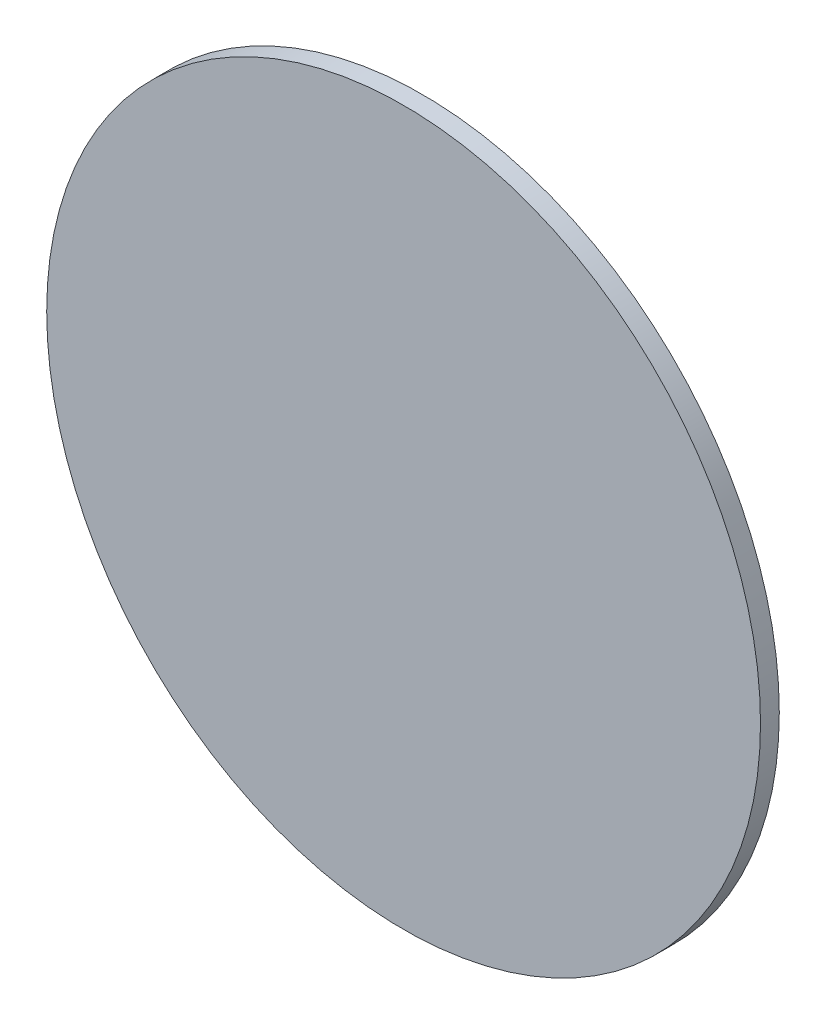
ISO-10303-21;
HEADER;
FILE_DESCRIPTION(('STEP AP214'),'2;1');
FILE_NAME('part.step','',(''),(''),'','','');
FILE_SCHEMA(('AUTOMOTIVE_DESIGN { 1 0 10303 214 1 1 1 1 }'));
ENDSEC;
DATA;
#1=APPLICATION_CONTEXT('core data for automotive mechanical design processes');
#2=APPLICATION_PROTOCOL_DEFINITION('international standard','automotive_design',2000,#1);
#3=PRODUCT_CONTEXT('',#1,'mechanical');
#4=PRODUCT('Part','Part','',(#3));
#5=PRODUCT_RELATED_PRODUCT_CATEGORY('part','',(#4));
#6=PRODUCT_DEFINITION_FORMATION('','',#4);
#7=PRODUCT_DEFINITION_CONTEXT('part definition',#1,'design');
#8=PRODUCT_DEFINITION('design','',#6,#7);
#9=PRODUCT_DEFINITION_SHAPE('','',#8);
#10=(LENGTH_UNIT() NAMED_UNIT(*) SI_UNIT(.MILLI.,.METRE.));
#11=(NAMED_UNIT(*) PLANE_ANGLE_UNIT() SI_UNIT($,.RADIAN.));
#12=(NAMED_UNIT(*) SI_UNIT($,.STERADIAN.) SOLID_ANGLE_UNIT());
#13=UNCERTAINTY_MEASURE_WITH_UNIT(LENGTH_MEASURE(1.E-05),#10,'distance_accuracy_value','');
#14=(GEOMETRIC_REPRESENTATION_CONTEXT(3) GLOBAL_UNCERTAINTY_ASSIGNED_CONTEXT((#13)) GLOBAL_UNIT_ASSIGNED_CONTEXT((#10,
#11,#12)) REPRESENTATION_CONTEXT('',''));
#15=CARTESIAN_POINT('',(0.,0.,0.));
#16=DIRECTION('',(0.,0.,1.));
#17=DIRECTION('',(1.,0.,0.));
#18=AXIS2_PLACEMENT_3D('',#15,#16,#17);
#19=CARTESIAN_POINT('',(0.,0.,2.));
#20=DIRECTION('',(0.,0.,-1.));
#21=DIRECTION('',(-1.,0.,0.));
#22=AXIS2_PLACEMENT_3D('',#19,#20,#21);
#23=CYLINDRICAL_SURFACE('',#22,38.);
#24=CARTESIAN_POINT('',(0.,0.,2.));
#25=DIRECTION('',(0.,0.,1.));
#26=DIRECTION('',(1.,0.,0.));
#27=AXIS2_PLACEMENT_3D('',#24,#25,#26);
#28=CIRCLE('',#27,38.);
#29=CARTESIAN_POINT('',(38.,0.,2.));
#30=VERTEX_POINT('',#29);
#31=EDGE_CURVE('E10',#30,#30,#28,.T.);
#32=ORIENTED_EDGE('',*,*,#31,.F.);
#33=EDGE_LOOP('',(#32));
#34=FACE_BOUND('',#33,.T.);
#35=CARTESIAN_POINT('',(0.,0.,0.));
#36=DIRECTION('',(0.,0.,1.));
#37=DIRECTION('',(1.,0.,0.));
#38=AXIS2_PLACEMENT_3D('',#35,#36,#37);
#39=CIRCLE('',#38,38.);
#40=CARTESIAN_POINT('',(38.,0.,0.));
#41=VERTEX_POINT('',#40);
#42=EDGE_CURVE('E34',#41,#41,#39,.T.);
#43=ORIENTED_EDGE('',*,*,#42,.T.);
#44=EDGE_LOOP('',(#43));
#45=FACE_BOUND('',#44,.T.);
#46=ADVANCED_FACE('F31',(#34,#45),#23,.T.);
#47=CARTESIAN_POINT('',(0.,0.,2.));
#48=DIRECTION('',(0.,0.,1.));
#49=DIRECTION('',(1.,0.,0.));
#50=AXIS2_PLACEMENT_3D('',#47,#48,#49);
#51=PLANE('',#50);
#52=ORIENTED_EDGE('',*,*,#31,.T.);
#53=EDGE_LOOP('',(#52));
#54=FACE_BOUND('',#53,.T.);
#55=ADVANCED_FACE('F46',(#54),#51,.T.);
#56=CARTESIAN_POINT('',(0.,0.,0.));
#57=DIRECTION('',(0.,0.,1.));
#58=DIRECTION('',(1.,0.,0.));
#59=AXIS2_PLACEMENT_3D('',#56,#57,#58);
#60=PLANE('',#59);
#61=ORIENTED_EDGE('',*,*,#42,.F.);
#62=EDGE_LOOP('',(#61));
#63=FACE_BOUND('',#62,.T.);
#64=ADVANCED_FACE('F44',(#63),#60,.F.);
#65=CLOSED_SHELL('',(#46,#55,#64));
#66=MANIFOLD_SOLID_BREP('B2',#65);
#67=ADVANCED_BREP_SHAPE_REPRESENTATION('',(#18,#66),#14);
#68=SHAPE_DEFINITION_REPRESENTATION(#9,#67);
ENDSEC;
END-ISO-10303-21;
